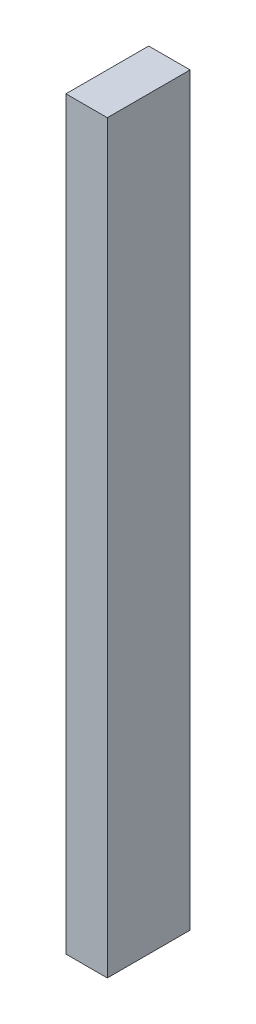
ISO-10303-21;
HEADER;
FILE_DESCRIPTION(('STEP AP214'),'2;1');
FILE_NAME('part.step','',(''),(''),'','','');
FILE_SCHEMA(('AUTOMOTIVE_DESIGN { 1 0 10303 214 1 1 1 1 }'));
ENDSEC;
DATA;
#1=APPLICATION_CONTEXT('core data for automotive mechanical design processes');
#2=APPLICATION_PROTOCOL_DEFINITION('international standard','automotive_design',2000,#1);
#3=PRODUCT_CONTEXT('',#1,'mechanical');
#4=PRODUCT('Part','Part','',(#3));
#5=PRODUCT_RELATED_PRODUCT_CATEGORY('part','',(#4));
#6=PRODUCT_DEFINITION_FORMATION('','',#4);
#7=PRODUCT_DEFINITION_CONTEXT('part definition',#1,'design');
#8=PRODUCT_DEFINITION('design','',#6,#7);
#9=PRODUCT_DEFINITION_SHAPE('','',#8);
#10=(LENGTH_UNIT() NAMED_UNIT(*) SI_UNIT(.MILLI.,.METRE.));
#11=(NAMED_UNIT(*) PLANE_ANGLE_UNIT() SI_UNIT($,.RADIAN.));
#12=(NAMED_UNIT(*) SI_UNIT($,.STERADIAN.) SOLID_ANGLE_UNIT());
#13=UNCERTAINTY_MEASURE_WITH_UNIT(LENGTH_MEASURE(1.E-05),#10,'distance_accuracy_value','');
#14=(GEOMETRIC_REPRESENTATION_CONTEXT(3) GLOBAL_UNCERTAINTY_ASSIGNED_CONTEXT((#13)) GLOBAL_UNIT_ASSIGNED_CONTEXT((#10,
#11,#12)) REPRESENTATION_CONTEXT('',''));
#15=CARTESIAN_POINT('',(0.,0.,0.));
#16=DIRECTION('',(0.,0.,1.));
#17=DIRECTION('',(1.,0.,0.));
#18=AXIS2_PLACEMENT_3D('',#15,#16,#17);
#19=CARTESIAN_POINT('',(2.,18.,-2.));
#20=DIRECTION('',(0.,0.,1.));
#21=DIRECTION('',(0.,-1.,0.));
#22=AXIS2_PLACEMENT_3D('',#19,#20,#21);
#23=PLANE('',#22);
#24=DIRECTION('',(0.,1.,0.));
#25=VECTOR('',#24,1.);
#26=CARTESIAN_POINT('',(0.,18.,-2.));
#27=LINE('',#26,#25);
#28=CARTESIAN_POINT('',(0.,-18.,-2.));
#29=VERTEX_POINT('',#28);
#30=CARTESIAN_POINT('',(0.,18.,-2.));
#31=VERTEX_POINT('',#30);
#32=EDGE_CURVE('E96',#29,#31,#27,.T.);
#33=ORIENTED_EDGE('',*,*,#32,.T.);
#34=DIRECTION('',(-1.,0.,0.));
#35=VECTOR('',#34,1.);
#36=CARTESIAN_POINT('',(2.,18.,-2.));
#37=LINE('',#36,#35);
#38=CARTESIAN_POINT('',(2.,18.,-2.));
#39=VERTEX_POINT('',#38);
#40=EDGE_CURVE('E11',#39,#31,#37,.T.);
#41=ORIENTED_EDGE('',*,*,#40,.F.);
#42=DIRECTION('',(0.,1.,0.));
#43=VECTOR('',#42,1.);
#44=CARTESIAN_POINT('',(2.,18.,-2.));
#45=LINE('',#44,#43);
#46=CARTESIAN_POINT('',(2.,-18.,-2.));
#47=VERTEX_POINT('',#46);
#48=EDGE_CURVE('E84',#47,#39,#45,.T.);
#49=ORIENTED_EDGE('',*,*,#48,.F.);
#50=DIRECTION('',(-1.,0.,0.));
#51=VECTOR('',#50,1.);
#52=CARTESIAN_POINT('',(2.,-18.,-2.));
#53=LINE('',#52,#51);
#54=EDGE_CURVE('E92',#47,#29,#53,.T.);
#55=ORIENTED_EDGE('',*,*,#54,.T.);
#56=EDGE_LOOP('',(#33,#41,#49,#55));
#57=FACE_BOUND('',#56,.T.);
#58=ADVANCED_FACE('F33',(#57),#23,.F.);
#59=CARTESIAN_POINT('',(2.,18.,2.));
#60=DIRECTION('',(0.,-1.,0.));
#61=DIRECTION('',(0.,0.,-1.));
#62=AXIS2_PLACEMENT_3D('',#59,#60,#61);
#63=PLANE('',#62);
#64=DIRECTION('',(0.,0.,1.));
#65=VECTOR('',#64,1.);
#66=CARTESIAN_POINT('',(0.,18.,2.));
#67=LINE('',#66,#65);
#68=CARTESIAN_POINT('',(0.,18.,2.));
#69=VERTEX_POINT('',#68);
#70=EDGE_CURVE('E88',#31,#69,#67,.T.);
#71=ORIENTED_EDGE('',*,*,#70,.T.);
#72=DIRECTION('',(-1.,0.,0.));
#73=VECTOR('',#72,1.);
#74=CARTESIAN_POINT('',(2.,18.,2.));
#75=LINE('',#74,#73);
#76=CARTESIAN_POINT('',(2.,18.,2.));
#77=VERTEX_POINT('',#76);
#78=EDGE_CURVE('E41',#77,#69,#75,.T.);
#79=ORIENTED_EDGE('',*,*,#78,.F.);
#80=DIRECTION('',(0.,0.,1.));
#81=VECTOR('',#80,1.);
#82=CARTESIAN_POINT('',(2.,18.,2.));
#83=LINE('',#82,#81);
#84=EDGE_CURVE('E79',#39,#77,#83,.T.);
#85=ORIENTED_EDGE('',*,*,#84,.F.);
#86=ORIENTED_EDGE('',*,*,#40,.T.);
#87=EDGE_LOOP('',(#71,#79,#85,#86));
#88=FACE_BOUND('',#87,.T.);
#89=ADVANCED_FACE('F87',(#88),#63,.F.);
#90=CARTESIAN_POINT('',(2.,18.,2.));
#91=DIRECTION('',(0.,0.,-1.));
#92=DIRECTION('',(0.,1.,0.));
#93=AXIS2_PLACEMENT_3D('',#90,#91,#92);
#94=PLANE('',#93);
#95=DIRECTION('',(0.,-1.,0.));
#96=VECTOR('',#95,1.);
#97=CARTESIAN_POINT('',(0.,18.,2.));
#98=LINE('',#97,#96);
#99=CARTESIAN_POINT('',(0.,-18.,2.));
#100=VERTEX_POINT('',#99);
#101=EDGE_CURVE('E66',#69,#100,#98,.T.);
#102=ORIENTED_EDGE('',*,*,#101,.T.);
#103=DIRECTION('',(-1.,0.,0.));
#104=VECTOR('',#103,1.);
#105=CARTESIAN_POINT('',(2.,-18.,2.));
#106=LINE('',#105,#104);
#107=CARTESIAN_POINT('',(2.,-18.,2.));
#108=VERTEX_POINT('',#107);
#109=EDGE_CURVE('E89',#108,#100,#106,.T.);
#110=ORIENTED_EDGE('',*,*,#109,.F.);
#111=DIRECTION('',(0.,-1.,0.));
#112=VECTOR('',#111,1.);
#113=CARTESIAN_POINT('',(2.,18.,2.));
#114=LINE('',#113,#112);
#115=EDGE_CURVE('E82',#77,#108,#114,.T.);
#116=ORIENTED_EDGE('',*,*,#115,.F.);
#117=ORIENTED_EDGE('',*,*,#78,.T.);
#118=EDGE_LOOP('',(#102,#110,#116,#117));
#119=FACE_BOUND('',#118,.T.);
#120=ADVANCED_FACE('F90',(#119),#94,.F.);
#121=CARTESIAN_POINT('',(2.,-18.,2.));
#122=DIRECTION('',(0.,1.,0.));
#123=DIRECTION('',(0.,0.,1.));
#124=AXIS2_PLACEMENT_3D('',#121,#122,#123);
#125=PLANE('',#124);
#126=DIRECTION('',(0.,0.,-1.));
#127=VECTOR('',#126,1.);
#128=CARTESIAN_POINT('',(0.,-18.,2.));
#129=LINE('',#128,#127);
#130=EDGE_CURVE('E72',#100,#29,#129,.T.);
#131=ORIENTED_EDGE('',*,*,#130,.T.);
#132=ORIENTED_EDGE('',*,*,#54,.F.);
#133=DIRECTION('',(0.,0.,-1.));
#134=VECTOR('',#133,1.);
#135=CARTESIAN_POINT('',(2.,-18.,2.));
#136=LINE('',#135,#134);
#137=EDGE_CURVE('E49',#108,#47,#136,.T.);
#138=ORIENTED_EDGE('',*,*,#137,.F.);
#139=ORIENTED_EDGE('',*,*,#109,.T.);
#140=EDGE_LOOP('',(#131,#132,#138,#139));
#141=FACE_BOUND('',#140,.T.);
#142=ADVANCED_FACE('F103',(#141),#125,.F.);
#143=CARTESIAN_POINT('',(2.,0.,0.));
#144=DIRECTION('',(1.,0.,0.));
#145=DIRECTION('',(0.,0.,-1.));
#146=AXIS2_PLACEMENT_3D('',#143,#144,#145);
#147=PLANE('',#146);
#148=ORIENTED_EDGE('',*,*,#48,.T.);
#149=ORIENTED_EDGE('',*,*,#84,.T.);
#150=ORIENTED_EDGE('',*,*,#115,.T.);
#151=ORIENTED_EDGE('',*,*,#137,.T.);
#152=EDGE_LOOP('',(#148,#149,#150,#151));
#153=FACE_BOUND('',#152,.T.);
#154=ADVANCED_FACE('F80',(#153),#147,.T.);
#155=CARTESIAN_POINT('',(0.,0.,0.));
#156=DIRECTION('',(1.,0.,0.));
#157=DIRECTION('',(0.,0.,-1.));
#158=AXIS2_PLACEMENT_3D('',#155,#156,#157);
#159=PLANE('',#158);
#160=ORIENTED_EDGE('',*,*,#32,.F.);
#161=ORIENTED_EDGE('',*,*,#130,.F.);
#162=ORIENTED_EDGE('',*,*,#101,.F.);
#163=ORIENTED_EDGE('',*,*,#70,.F.);
#164=EDGE_LOOP('',(#160,#161,#162,#163));
#165=FACE_BOUND('',#164,.T.);
#166=ADVANCED_FACE('F106',(#165),#159,.F.);
#167=CLOSED_SHELL('',(#58,#89,#120,#142,#154,#166));
#168=MANIFOLD_SOLID_BREP('B2',#167);
#169=ADVANCED_BREP_SHAPE_REPRESENTATION('',(#18,#168),#14);
#170=SHAPE_DEFINITION_REPRESENTATION(#9,#169);
ENDSEC;
END-ISO-10303-21;
